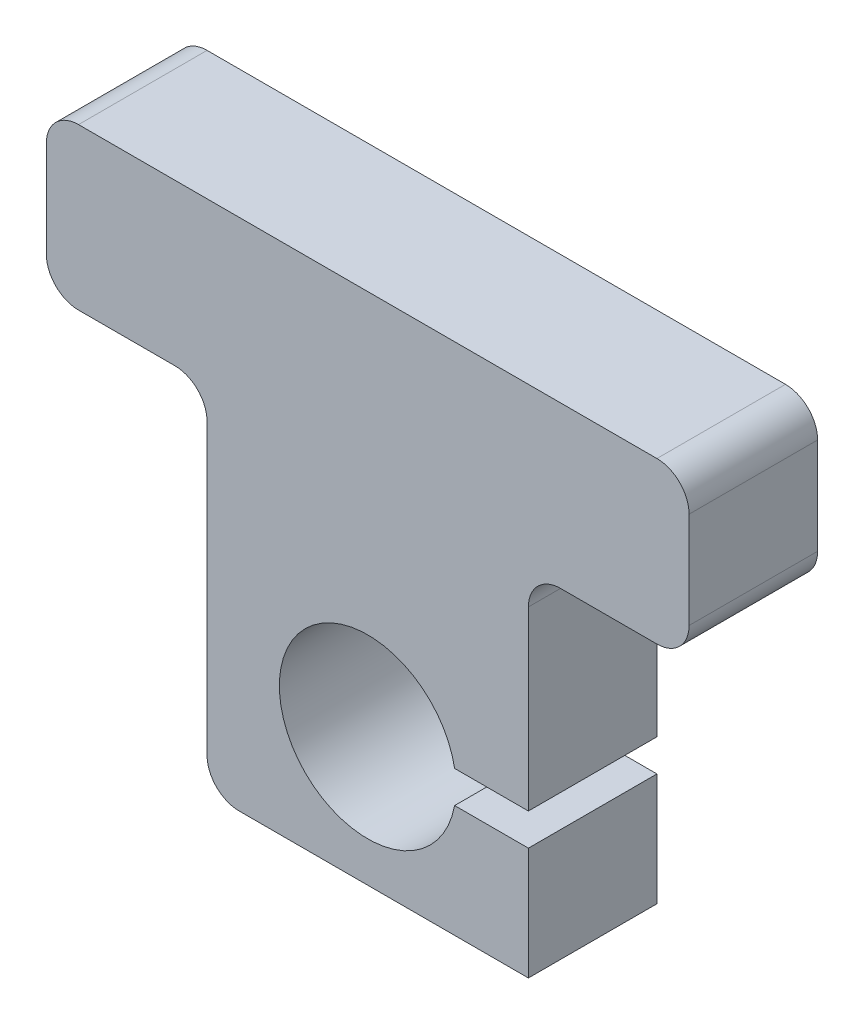
ISO-10303-21;
HEADER;
FILE_DESCRIPTION(('STEP AP214'),'2;1');
FILE_NAME('part.step','',(''),(''),'','','');
FILE_SCHEMA(('AUTOMOTIVE_DESIGN { 1 0 10303 214 1 1 1 1 }'));
ENDSEC;
DATA;
#1=APPLICATION_CONTEXT('core data for automotive mechanical design processes');
#2=APPLICATION_PROTOCOL_DEFINITION('international standard','automotive_design',2000,#1);
#3=PRODUCT_CONTEXT('',#1,'mechanical');
#4=PRODUCT('Part','Part','',(#3));
#5=PRODUCT_RELATED_PRODUCT_CATEGORY('part','',(#4));
#6=PRODUCT_DEFINITION_FORMATION('','',#4);
#7=PRODUCT_DEFINITION_CONTEXT('part definition',#1,'design');
#8=PRODUCT_DEFINITION('design','',#6,#7);
#9=PRODUCT_DEFINITION_SHAPE('','',#8);
#10=(LENGTH_UNIT() NAMED_UNIT(*) SI_UNIT(.MILLI.,.METRE.));
#11=(NAMED_UNIT(*) PLANE_ANGLE_UNIT() SI_UNIT($,.RADIAN.));
#12=(NAMED_UNIT(*) SI_UNIT($,.STERADIAN.) SOLID_ANGLE_UNIT());
#13=UNCERTAINTY_MEASURE_WITH_UNIT(LENGTH_MEASURE(1.E-05),#10,'distance_accuracy_value','');
#14=(GEOMETRIC_REPRESENTATION_CONTEXT(3) GLOBAL_UNCERTAINTY_ASSIGNED_CONTEXT((#13)) GLOBAL_UNIT_ASSIGNED_CONTEXT((#10,
#11,#12)) REPRESENTATION_CONTEXT('',''));
#15=CARTESIAN_POINT('',(0.,0.,0.));
#16=DIRECTION('',(0.,0.,1.));
#17=DIRECTION('',(1.,0.,0.));
#18=AXIS2_PLACEMENT_3D('',#15,#16,#17);
#19=CARTESIAN_POINT('',(12.,12.,8.));
#20=DIRECTION('',(0.,0.,-1.));
#21=DIRECTION('',(-1.,0.,0.));
#22=AXIS2_PLACEMENT_3D('',#19,#20,#21);
#23=CYLINDRICAL_SURFACE('',#22,2.);
#24=CARTESIAN_POINT('',(12.,12.,0.));
#25=DIRECTION('',(0.,0.,-1.));
#26=DIRECTION('',(1.,0.,0.));
#27=AXIS2_PLACEMENT_3D('',#24,#25,#26);
#28=CIRCLE('',#27,2.);
#29=CARTESIAN_POINT('',(10.,12.,0.));
#30=VERTEX_POINT('',#29);
#31=CARTESIAN_POINT('',(12.,14.,0.));
#32=VERTEX_POINT('',#31);
#33=EDGE_CURVE('E195',#30,#32,#28,.T.);
#34=ORIENTED_EDGE('',*,*,#33,.T.);
#35=DIRECTION('',(0.,0.,-1.));
#36=VECTOR('',#35,1.);
#37=CARTESIAN_POINT('',(12.,14.,8.));
#38=LINE('',#37,#36);
#39=CARTESIAN_POINT('',(12.,14.,8.));
#40=VERTEX_POINT('',#39);
#41=EDGE_CURVE('E11',#40,#32,#38,.T.);
#42=ORIENTED_EDGE('',*,*,#41,.F.);
#43=CARTESIAN_POINT('',(12.,12.,8.));
#44=DIRECTION('',(0.,0.,-1.));
#45=DIRECTION('',(1.,0.,0.));
#46=AXIS2_PLACEMENT_3D('',#43,#44,#45);
#47=CIRCLE('',#46,2.);
#48=CARTESIAN_POINT('',(10.,12.,8.));
#49=VERTEX_POINT('',#48);
#50=EDGE_CURVE('E231',#49,#40,#47,.T.);
#51=ORIENTED_EDGE('',*,*,#50,.F.);
#52=DIRECTION('',(0.,0.,-1.));
#53=VECTOR('',#52,1.);
#54=CARTESIAN_POINT('',(10.,12.,8.));
#55=LINE('',#54,#53);
#56=EDGE_CURVE('E191',#49,#30,#55,.T.);
#57=ORIENTED_EDGE('',*,*,#56,.T.);
#58=EDGE_LOOP('',(#34,#42,#51,#57));
#59=FACE_BOUND('',#58,.T.);
#60=ADVANCED_FACE('F33',(#59),#23,.F.);
#61=CARTESIAN_POINT('',(12.,14.,8.));
#62=DIRECTION('',(0.,1.,0.));
#63=DIRECTION('',(0.,0.,1.));
#64=AXIS2_PLACEMENT_3D('',#61,#62,#63);
#65=PLANE('',#64);
#66=DIRECTION('',(1.,0.,0.));
#67=VECTOR('',#66,1.);
#68=CARTESIAN_POINT('',(12.,14.,0.));
#69=LINE('',#68,#67);
#70=CARTESIAN_POINT('',(18.,14.,0.));
#71=VERTEX_POINT('',#70);
#72=EDGE_CURVE('E198',#32,#71,#69,.T.);
#73=ORIENTED_EDGE('',*,*,#72,.T.);
#74=DIRECTION('',(0.,0.,-1.));
#75=VECTOR('',#74,1.);
#76=CARTESIAN_POINT('',(18.,14.,8.));
#77=LINE('',#76,#75);
#78=CARTESIAN_POINT('',(18.,14.,8.));
#79=VERTEX_POINT('',#78);
#80=EDGE_CURVE('E41',#79,#71,#77,.T.);
#81=ORIENTED_EDGE('',*,*,#80,.F.);
#82=DIRECTION('',(1.,0.,0.));
#83=VECTOR('',#82,1.);
#84=CARTESIAN_POINT('',(12.,14.,8.));
#85=LINE('',#84,#83);
#86=EDGE_CURVE('E125',#40,#79,#85,.T.);
#87=ORIENTED_EDGE('',*,*,#86,.F.);
#88=ORIENTED_EDGE('',*,*,#41,.T.);
#89=EDGE_LOOP('',(#73,#81,#87,#88));
#90=FACE_BOUND('',#89,.T.);
#91=ADVANCED_FACE('F344',(#90),#65,.F.);
#92=CARTESIAN_POINT('',(18.,16.,8.));
#93=DIRECTION('',(0.,0.,-1.));
#94=DIRECTION('',(-1.,0.,0.));
#95=AXIS2_PLACEMENT_3D('',#92,#93,#94);
#96=CYLINDRICAL_SURFACE('',#95,2.);
#97=CARTESIAN_POINT('',(18.,16.,0.));
#98=DIRECTION('',(0.,0.,1.));
#99=DIRECTION('',(1.,0.,0.));
#100=AXIS2_PLACEMENT_3D('',#97,#98,#99);
#101=CIRCLE('',#100,2.);
#102=CARTESIAN_POINT('',(20.,16.,0.));
#103=VERTEX_POINT('',#102);
#104=EDGE_CURVE('E200',#71,#103,#101,.T.);
#105=ORIENTED_EDGE('',*,*,#104,.T.);
#106=DIRECTION('',(0.,0.,-1.));
#107=VECTOR('',#106,1.);
#108=CARTESIAN_POINT('',(20.,16.,8.));
#109=LINE('',#108,#107);
#110=CARTESIAN_POINT('',(20.,16.,8.));
#111=VERTEX_POINT('',#110);
#112=EDGE_CURVE('E271',#111,#103,#109,.T.);
#113=ORIENTED_EDGE('',*,*,#112,.F.);
#114=CARTESIAN_POINT('',(18.,16.,8.));
#115=DIRECTION('',(0.,0.,1.));
#116=DIRECTION('',(1.,0.,0.));
#117=AXIS2_PLACEMENT_3D('',#114,#115,#116);
#118=CIRCLE('',#117,2.);
#119=EDGE_CURVE('E279',#79,#111,#118,.T.);
#120=ORIENTED_EDGE('',*,*,#119,.F.);
#121=ORIENTED_EDGE('',*,*,#80,.T.);
#122=EDGE_LOOP('',(#105,#113,#120,#121));
#123=FACE_BOUND('',#122,.T.);
#124=ADVANCED_FACE('F277',(#123),#96,.T.);
#125=CARTESIAN_POINT('',(20.,22.,8.));
#126=DIRECTION('',(-1.,0.,0.));
#127=DIRECTION('',(0.,-1.,0.));
#128=AXIS2_PLACEMENT_3D('',#125,#126,#127);
#129=PLANE('',#128);
#130=DIRECTION('',(0.,1.,0.));
#131=VECTOR('',#130,1.);
#132=CARTESIAN_POINT('',(20.,22.,0.));
#133=LINE('',#132,#131);
#134=CARTESIAN_POINT('',(20.,22.,0.));
#135=VERTEX_POINT('',#134);
#136=EDGE_CURVE('E202',#103,#135,#133,.T.);
#137=ORIENTED_EDGE('',*,*,#136,.T.);
#138=DIRECTION('',(0.,0.,-1.));
#139=VECTOR('',#138,1.);
#140=CARTESIAN_POINT('',(20.,22.,8.));
#141=LINE('',#140,#139);
#142=CARTESIAN_POINT('',(20.,22.,8.));
#143=VERTEX_POINT('',#142);
#144=EDGE_CURVE('E268',#143,#135,#141,.T.);
#145=ORIENTED_EDGE('',*,*,#144,.F.);
#146=DIRECTION('',(0.,1.,0.));
#147=VECTOR('',#146,1.);
#148=CARTESIAN_POINT('',(20.,22.,8.));
#149=LINE('',#148,#147);
#150=EDGE_CURVE('E297',#111,#143,#149,.T.);
#151=ORIENTED_EDGE('',*,*,#150,.F.);
#152=ORIENTED_EDGE('',*,*,#112,.T.);
#153=EDGE_LOOP('',(#137,#145,#151,#152));
#154=FACE_BOUND('',#153,.T.);
#155=ADVANCED_FACE('F288',(#154),#129,.F.);
#156=CARTESIAN_POINT('',(18.,22.,8.));
#157=DIRECTION('',(0.,0.,-1.));
#158=DIRECTION('',(-1.,0.,0.));
#159=AXIS2_PLACEMENT_3D('',#156,#157,#158);
#160=CYLINDRICAL_SURFACE('',#159,2.);
#161=CARTESIAN_POINT('',(18.,22.,0.));
#162=DIRECTION('',(0.,0.,1.));
#163=DIRECTION('',(-1.,0.,0.));
#164=AXIS2_PLACEMENT_3D('',#161,#162,#163);
#165=CIRCLE('',#164,2.);
#166=CARTESIAN_POINT('',(18.,24.,0.));
#167=VERTEX_POINT('',#166);
#168=EDGE_CURVE('E204',#135,#167,#165,.T.);
#169=ORIENTED_EDGE('',*,*,#168,.T.);
#170=DIRECTION('',(0.,0.,-1.));
#171=VECTOR('',#170,1.);
#172=CARTESIAN_POINT('',(18.,24.,8.));
#173=LINE('',#172,#171);
#174=CARTESIAN_POINT('',(18.,24.,8.));
#175=VERTEX_POINT('',#174);
#176=EDGE_CURVE('E265',#175,#167,#173,.T.);
#177=ORIENTED_EDGE('',*,*,#176,.F.);
#178=CARTESIAN_POINT('',(18.,22.,8.));
#179=DIRECTION('',(0.,0.,1.));
#180=DIRECTION('',(-1.,0.,0.));
#181=AXIS2_PLACEMENT_3D('',#178,#179,#180);
#182=CIRCLE('',#181,2.);
#183=EDGE_CURVE('E294',#143,#175,#182,.T.);
#184=ORIENTED_EDGE('',*,*,#183,.F.);
#185=ORIENTED_EDGE('',*,*,#144,.T.);
#186=EDGE_LOOP('',(#169,#177,#184,#185));
#187=FACE_BOUND('',#186,.T.);
#188=ADVANCED_FACE('F292',(#187),#160,.T.);
#189=CARTESIAN_POINT('',(-18.,24.,8.));
#190=DIRECTION('',(0.,-1.,0.));
#191=DIRECTION('',(0.,0.,-1.));
#192=AXIS2_PLACEMENT_3D('',#189,#190,#191);
#193=PLANE('',#192);
#194=DIRECTION('',(-1.,0.,0.));
#195=VECTOR('',#194,1.);
#196=CARTESIAN_POINT('',(-18.,24.,0.));
#197=LINE('',#196,#195);
#198=CARTESIAN_POINT('',(-18.,24.,0.));
#199=VERTEX_POINT('',#198);
#200=EDGE_CURVE('E206',#167,#199,#197,.T.);
#201=ORIENTED_EDGE('',*,*,#200,.T.);
#202=DIRECTION('',(0.,0.,-1.));
#203=VECTOR('',#202,1.);
#204=CARTESIAN_POINT('',(-18.,24.,8.));
#205=LINE('',#204,#203);
#206=CARTESIAN_POINT('',(-18.,24.,8.));
#207=VERTEX_POINT('',#206);
#208=EDGE_CURVE('E262',#207,#199,#205,.T.);
#209=ORIENTED_EDGE('',*,*,#208,.F.);
#210=DIRECTION('',(-1.,0.,0.));
#211=VECTOR('',#210,1.);
#212=CARTESIAN_POINT('',(-18.,24.,8.));
#213=LINE('',#212,#211);
#214=EDGE_CURVE('E296',#175,#207,#213,.T.);
#215=ORIENTED_EDGE('',*,*,#214,.F.);
#216=ORIENTED_EDGE('',*,*,#176,.T.);
#217=EDGE_LOOP('',(#201,#209,#215,#216));
#218=FACE_BOUND('',#217,.T.);
#219=ADVANCED_FACE('F357',(#218),#193,.F.);
#220=CARTESIAN_POINT('',(-18.,22.,8.));
#221=DIRECTION('',(0.,0.,-1.));
#222=DIRECTION('',(-1.,0.,0.));
#223=AXIS2_PLACEMENT_3D('',#220,#221,#222);
#224=CYLINDRICAL_SURFACE('',#223,2.);
#225=CARTESIAN_POINT('',(-18.,22.,0.));
#226=DIRECTION('',(0.,0.,1.));
#227=DIRECTION('',(1.,0.,0.));
#228=AXIS2_PLACEMENT_3D('',#225,#226,#227);
#229=CIRCLE('',#228,2.);
#230=CARTESIAN_POINT('',(-20.,22.,0.));
#231=VERTEX_POINT('',#230);
#232=EDGE_CURVE('E208',#199,#231,#229,.T.);
#233=ORIENTED_EDGE('',*,*,#232,.T.);
#234=DIRECTION('',(0.,0.,-1.));
#235=VECTOR('',#234,1.);
#236=CARTESIAN_POINT('',(-20.,22.,8.));
#237=LINE('',#236,#235);
#238=CARTESIAN_POINT('',(-20.,22.,8.));
#239=VERTEX_POINT('',#238);
#240=EDGE_CURVE('E259',#239,#231,#237,.T.);
#241=ORIENTED_EDGE('',*,*,#240,.F.);
#242=CARTESIAN_POINT('',(-18.,22.,8.));
#243=DIRECTION('',(0.,0.,1.));
#244=DIRECTION('',(1.,0.,0.));
#245=AXIS2_PLACEMENT_3D('',#242,#243,#244);
#246=CIRCLE('',#245,2.);
#247=EDGE_CURVE('E299',#207,#239,#246,.T.);
#248=ORIENTED_EDGE('',*,*,#247,.F.);
#249=ORIENTED_EDGE('',*,*,#208,.T.);
#250=EDGE_LOOP('',(#233,#241,#248,#249));
#251=FACE_BOUND('',#250,.T.);
#252=ADVANCED_FACE('F360',(#251),#224,.T.);
#253=CARTESIAN_POINT('',(-20.,22.,8.));
#254=DIRECTION('',(1.,0.,0.));
#255=DIRECTION('',(0.,0.,-1.));
#256=AXIS2_PLACEMENT_3D('',#253,#254,#255);
#257=PLANE('',#256);
#258=DIRECTION('',(0.,-1.,0.));
#259=VECTOR('',#258,1.);
#260=CARTESIAN_POINT('',(-20.,22.,0.));
#261=LINE('',#260,#259);
#262=CARTESIAN_POINT('',(-20.,16.,0.));
#263=VERTEX_POINT('',#262);
#264=EDGE_CURVE('E210',#231,#263,#261,.T.);
#265=ORIENTED_EDGE('',*,*,#264,.T.);
#266=DIRECTION('',(0.,0.,-1.));
#267=VECTOR('',#266,1.);
#268=CARTESIAN_POINT('',(-20.,16.,8.));
#269=LINE('',#268,#267);
#270=CARTESIAN_POINT('',(-20.,16.,8.));
#271=VERTEX_POINT('',#270);
#272=EDGE_CURVE('E256',#271,#263,#269,.T.);
#273=ORIENTED_EDGE('',*,*,#272,.F.);
#274=DIRECTION('',(0.,-1.,0.));
#275=VECTOR('',#274,1.);
#276=CARTESIAN_POINT('',(-20.,22.,8.));
#277=LINE('',#276,#275);
#278=EDGE_CURVE('E305',#239,#271,#277,.T.);
#279=ORIENTED_EDGE('',*,*,#278,.F.);
#280=ORIENTED_EDGE('',*,*,#240,.T.);
#281=EDGE_LOOP('',(#265,#273,#279,#280));
#282=FACE_BOUND('',#281,.T.);
#283=ADVANCED_FACE('F364',(#282),#257,.F.);
#284=CARTESIAN_POINT('',(-18.,16.,8.));
#285=DIRECTION('',(0.,0.,-1.));
#286=DIRECTION('',(-1.,0.,0.));
#287=AXIS2_PLACEMENT_3D('',#284,#285,#286);
#288=CYLINDRICAL_SURFACE('',#287,2.);
#289=CARTESIAN_POINT('',(-18.,16.,0.));
#290=DIRECTION('',(0.,0.,1.));
#291=DIRECTION('',(1.,0.,0.));
#292=AXIS2_PLACEMENT_3D('',#289,#290,#291);
#293=CIRCLE('',#292,2.);
#294=CARTESIAN_POINT('',(-18.,14.,0.));
#295=VERTEX_POINT('',#294);
#296=EDGE_CURVE('E212',#263,#295,#293,.T.);
#297=ORIENTED_EDGE('',*,*,#296,.T.);
#298=DIRECTION('',(0.,0.,-1.));
#299=VECTOR('',#298,1.);
#300=CARTESIAN_POINT('',(-18.,14.,8.));
#301=LINE('',#300,#299);
#302=CARTESIAN_POINT('',(-18.,14.,8.));
#303=VERTEX_POINT('',#302);
#304=EDGE_CURVE('E253',#303,#295,#301,.T.);
#305=ORIENTED_EDGE('',*,*,#304,.F.);
#306=CARTESIAN_POINT('',(-18.,16.,8.));
#307=DIRECTION('',(0.,0.,1.));
#308=DIRECTION('',(1.,0.,0.));
#309=AXIS2_PLACEMENT_3D('',#306,#307,#308);
#310=CIRCLE('',#309,2.);
#311=EDGE_CURVE('E307',#271,#303,#310,.T.);
#312=ORIENTED_EDGE('',*,*,#311,.F.);
#313=ORIENTED_EDGE('',*,*,#272,.T.);
#314=EDGE_LOOP('',(#297,#305,#312,#313));
#315=FACE_BOUND('',#314,.T.);
#316=ADVANCED_FACE('F368',(#315),#288,.T.);
#317=CARTESIAN_POINT('',(-18.,14.,8.));
#318=DIRECTION('',(0.,1.,0.));
#319=DIRECTION('',(0.,0.,1.));
#320=AXIS2_PLACEMENT_3D('',#317,#318,#319);
#321=PLANE('',#320);
#322=DIRECTION('',(1.,0.,0.));
#323=VECTOR('',#322,1.);
#324=CARTESIAN_POINT('',(-18.,14.,0.));
#325=LINE('',#324,#323);
#326=CARTESIAN_POINT('',(-12.,14.,0.));
#327=VERTEX_POINT('',#326);
#328=EDGE_CURVE('E214',#295,#327,#325,.T.);
#329=ORIENTED_EDGE('',*,*,#328,.T.);
#330=DIRECTION('',(0.,0.,-1.));
#331=VECTOR('',#330,1.);
#332=CARTESIAN_POINT('',(-12.,14.,8.));
#333=LINE('',#332,#331);
#334=CARTESIAN_POINT('',(-12.,14.,8.));
#335=VERTEX_POINT('',#334);
#336=EDGE_CURVE('E250',#335,#327,#333,.T.);
#337=ORIENTED_EDGE('',*,*,#336,.F.);
#338=DIRECTION('',(1.,0.,0.));
#339=VECTOR('',#338,1.);
#340=CARTESIAN_POINT('',(-18.,14.,8.));
#341=LINE('',#340,#339);
#342=EDGE_CURVE('E309',#303,#335,#341,.T.);
#343=ORIENTED_EDGE('',*,*,#342,.F.);
#344=ORIENTED_EDGE('',*,*,#304,.T.);
#345=EDGE_LOOP('',(#329,#337,#343,#344));
#346=FACE_BOUND('',#345,.T.);
#347=ADVANCED_FACE('F372',(#346),#321,.F.);
#348=CARTESIAN_POINT('',(-12.,12.,8.));
#349=DIRECTION('',(0.,0.,-1.));
#350=DIRECTION('',(-1.,0.,0.));
#351=AXIS2_PLACEMENT_3D('',#348,#349,#350);
#352=CYLINDRICAL_SURFACE('',#351,2.);
#353=CARTESIAN_POINT('',(-12.,12.,0.));
#354=DIRECTION('',(0.,0.,-1.));
#355=DIRECTION('',(1.,0.,0.));
#356=AXIS2_PLACEMENT_3D('',#353,#354,#355);
#357=CIRCLE('',#356,2.);
#358=CARTESIAN_POINT('',(-10.,12.,0.));
#359=VERTEX_POINT('',#358);
#360=EDGE_CURVE('E216',#327,#359,#357,.T.);
#361=ORIENTED_EDGE('',*,*,#360,.T.);
#362=DIRECTION('',(0.,0.,-1.));
#363=VECTOR('',#362,1.);
#364=CARTESIAN_POINT('',(-10.,12.,8.));
#365=LINE('',#364,#363);
#366=CARTESIAN_POINT('',(-10.,12.,8.));
#367=VERTEX_POINT('',#366);
#368=EDGE_CURVE('E247',#367,#359,#365,.T.);
#369=ORIENTED_EDGE('',*,*,#368,.F.);
#370=CARTESIAN_POINT('',(-12.,12.,8.));
#371=DIRECTION('',(0.,0.,-1.));
#372=DIRECTION('',(1.,0.,0.));
#373=AXIS2_PLACEMENT_3D('',#370,#371,#372);
#374=CIRCLE('',#373,2.);
#375=EDGE_CURVE('E311',#335,#367,#374,.T.);
#376=ORIENTED_EDGE('',*,*,#375,.F.);
#377=ORIENTED_EDGE('',*,*,#336,.T.);
#378=EDGE_LOOP('',(#361,#369,#376,#377));
#379=FACE_BOUND('',#378,.T.);
#380=ADVANCED_FACE('F376',(#379),#352,.F.);
#381=CARTESIAN_POINT('',(-10.,-6.,8.));
#382=DIRECTION('',(1.,0.,0.));
#383=DIRECTION('',(0.,0.,-1.));
#384=AXIS2_PLACEMENT_3D('',#381,#382,#383);
#385=PLANE('',#384);
#386=DIRECTION('',(0.,-1.,0.));
#387=VECTOR('',#386,1.);
#388=CARTESIAN_POINT('',(-10.,-6.,0.));
#389=LINE('',#388,#387);
#390=CARTESIAN_POINT('',(-10.,-6.,0.));
#391=VERTEX_POINT('',#390);
#392=EDGE_CURVE('E218',#359,#391,#389,.T.);
#393=ORIENTED_EDGE('',*,*,#392,.T.);
#394=DIRECTION('',(0.,0.,-1.));
#395=VECTOR('',#394,1.);
#396=CARTESIAN_POINT('',(-10.,-6.,8.));
#397=LINE('',#396,#395);
#398=CARTESIAN_POINT('',(-10.,-6.,8.));
#399=VERTEX_POINT('',#398);
#400=EDGE_CURVE('E244',#399,#391,#397,.T.);
#401=ORIENTED_EDGE('',*,*,#400,.F.);
#402=DIRECTION('',(0.,-1.,0.));
#403=VECTOR('',#402,1.);
#404=CARTESIAN_POINT('',(-10.,-6.,8.));
#405=LINE('',#404,#403);
#406=EDGE_CURVE('E313',#367,#399,#405,.T.);
#407=ORIENTED_EDGE('',*,*,#406,.F.);
#408=ORIENTED_EDGE('',*,*,#368,.T.);
#409=EDGE_LOOP('',(#393,#401,#407,#408));
#410=FACE_BOUND('',#409,.T.);
#411=ADVANCED_FACE('F380',(#410),#385,.F.);
#412=CARTESIAN_POINT('',(-8.,-6.,8.));
#413=DIRECTION('',(0.,0.,-1.));
#414=DIRECTION('',(-1.,0.,0.));
#415=AXIS2_PLACEMENT_3D('',#412,#413,#414);
#416=CYLINDRICAL_SURFACE('',#415,2.);
#417=CARTESIAN_POINT('',(-8.,-6.,0.));
#418=DIRECTION('',(0.,0.,1.));
#419=DIRECTION('',(-1.,0.,0.));
#420=AXIS2_PLACEMENT_3D('',#417,#418,#419);
#421=CIRCLE('',#420,2.);
#422=CARTESIAN_POINT('',(-8.,-8.,0.));
#423=VERTEX_POINT('',#422);
#424=EDGE_CURVE('E220',#391,#423,#421,.T.);
#425=ORIENTED_EDGE('',*,*,#424,.T.);
#426=DIRECTION('',(0.,0.,-1.));
#427=VECTOR('',#426,1.);
#428=CARTESIAN_POINT('',(-8.,-8.,8.));
#429=LINE('',#428,#427);
#430=CARTESIAN_POINT('',(-8.,-8.,8.));
#431=VERTEX_POINT('',#430);
#432=EDGE_CURVE('E241',#431,#423,#429,.T.);
#433=ORIENTED_EDGE('',*,*,#432,.F.);
#434=CARTESIAN_POINT('',(-8.,-6.,8.));
#435=DIRECTION('',(0.,0.,1.));
#436=DIRECTION('',(-1.,0.,0.));
#437=AXIS2_PLACEMENT_3D('',#434,#435,#436);
#438=CIRCLE('',#437,2.);
#439=EDGE_CURVE('E315',#399,#431,#438,.T.);
#440=ORIENTED_EDGE('',*,*,#439,.F.);
#441=ORIENTED_EDGE('',*,*,#400,.T.);
#442=EDGE_LOOP('',(#425,#433,#440,#441));
#443=FACE_BOUND('',#442,.T.);
#444=ADVANCED_FACE('F384',(#443),#416,.T.);
#445=CARTESIAN_POINT('',(-8.,-8.,8.));
#446=DIRECTION('',(0.,1.,0.));
#447=DIRECTION('',(0.,0.,1.));
#448=AXIS2_PLACEMENT_3D('',#445,#446,#447);
#449=PLANE('',#448);
#450=DIRECTION('',(1.,0.,0.));
#451=VECTOR('',#450,1.);
#452=CARTESIAN_POINT('',(-8.,-8.,0.));
#453=LINE('',#452,#451);
#454=CARTESIAN_POINT('',(10.,-8.,0.));
#455=VERTEX_POINT('',#454);
#456=EDGE_CURVE('E222',#423,#455,#453,.T.);
#457=ORIENTED_EDGE('',*,*,#456,.T.);
#458=DIRECTION('',(0.,0.,-1.));
#459=VECTOR('',#458,1.);
#460=CARTESIAN_POINT('',(10.,-8.,8.));
#461=LINE('',#460,#459);
#462=CARTESIAN_POINT('',(10.,-8.,8.));
#463=VERTEX_POINT('',#462);
#464=EDGE_CURVE('E238',#463,#455,#461,.T.);
#465=ORIENTED_EDGE('',*,*,#464,.F.);
#466=DIRECTION('',(1.,0.,0.));
#467=VECTOR('',#466,1.);
#468=CARTESIAN_POINT('',(-8.,-8.,8.));
#469=LINE('',#468,#467);
#470=EDGE_CURVE('E317',#431,#463,#469,.T.);
#471=ORIENTED_EDGE('',*,*,#470,.F.);
#472=ORIENTED_EDGE('',*,*,#432,.T.);
#473=EDGE_LOOP('',(#457,#465,#471,#472));
#474=FACE_BOUND('',#473,.T.);
#475=ADVANCED_FACE('F388',(#474),#449,.F.);
#476=CARTESIAN_POINT('',(10.,-8.,8.));
#477=DIRECTION('',(-1.,0.,0.));
#478=DIRECTION('',(0.,0.,1.));
#479=AXIS2_PLACEMENT_3D('',#476,#477,#478);
#480=PLANE('',#479);
#481=DIRECTION('',(0.,1.,0.));
#482=VECTOR('',#481,1.);
#483=CARTESIAN_POINT('',(10.,-8.,0.));
#484=LINE('',#483,#482);
#485=CARTESIAN_POINT('',(10.,-1.,0.));
#486=VERTEX_POINT('',#485);
#487=EDGE_CURVE('E224',#455,#486,#484,.T.);
#488=ORIENTED_EDGE('',*,*,#487,.T.);
#489=DIRECTION('',(0.,0.,-1.));
#490=VECTOR('',#489,1.);
#491=CARTESIAN_POINT('',(10.,-1.,8.));
#492=LINE('',#491,#490);
#493=CARTESIAN_POINT('',(10.,-1.,8.));
#494=VERTEX_POINT('',#493);
#495=EDGE_CURVE('E235',#494,#486,#492,.T.);
#496=ORIENTED_EDGE('',*,*,#495,.F.);
#497=DIRECTION('',(0.,1.,0.));
#498=VECTOR('',#497,1.);
#499=CARTESIAN_POINT('',(10.,-8.,8.));
#500=LINE('',#499,#498);
#501=EDGE_CURVE('E319',#463,#494,#500,.T.);
#502=ORIENTED_EDGE('',*,*,#501,.F.);
#503=ORIENTED_EDGE('',*,*,#464,.T.);
#504=EDGE_LOOP('',(#488,#496,#502,#503));
#505=FACE_BOUND('',#504,.T.);
#506=ADVANCED_FACE('F325',(#505),#480,.F.);
#507=CARTESIAN_POINT('',(5.40832691319598,-1.,8.));
#508=DIRECTION('',(0.,-1.,0.));
#509=DIRECTION('',(1.,0.,0.));
#510=AXIS2_PLACEMENT_3D('',#507,#508,#509);
#511=PLANE('',#510);
#512=DIRECTION('',(-1.,0.,0.));
#513=VECTOR('',#512,1.);
#514=CARTESIAN_POINT('',(5.40832691319598,-1.,0.));
#515=LINE('',#514,#513);
#516=CARTESIAN_POINT('',(5.40832691319598,-1.,0.));
#517=VERTEX_POINT('',#516);
#518=EDGE_CURVE('E226',#486,#517,#515,.T.);
#519=ORIENTED_EDGE('',*,*,#518,.T.);
#520=DIRECTION('',(0.,0.,-1.));
#521=VECTOR('',#520,1.);
#522=CARTESIAN_POINT('',(5.40832691319598,-1.,8.));
#523=LINE('',#522,#521);
#524=CARTESIAN_POINT('',(5.40832691319598,-1.,8.));
#525=VERTEX_POINT('',#524);
#526=EDGE_CURVE('E186',#525,#517,#523,.T.);
#527=ORIENTED_EDGE('',*,*,#526,.F.);
#528=DIRECTION('',(-1.,0.,0.));
#529=VECTOR('',#528,1.);
#530=CARTESIAN_POINT('',(5.40832691319598,-1.,8.));
#531=LINE('',#530,#529);
#532=EDGE_CURVE('E177',#494,#525,#531,.T.);
#533=ORIENTED_EDGE('',*,*,#532,.F.);
#534=ORIENTED_EDGE('',*,*,#495,.T.);
#535=EDGE_LOOP('',(#519,#527,#533,#534));
#536=FACE_BOUND('',#535,.T.);
#537=ADVANCED_FACE('F329',(#536),#511,.F.);
#538=CARTESIAN_POINT('',(0.,0.,8.));
#539=DIRECTION('',(0.,0.,-1.));
#540=DIRECTION('',(-1.,0.,0.));
#541=AXIS2_PLACEMENT_3D('',#538,#539,#540);
#542=CYLINDRICAL_SURFACE('',#541,5.5);
#543=CARTESIAN_POINT('',(0.,0.,0.));
#544=DIRECTION('',(0.,0.,-1.));
#545=DIRECTION('',(1.,0.,0.));
#546=AXIS2_PLACEMENT_3D('',#543,#544,#545);
#547=CIRCLE('',#546,5.5);
#548=CARTESIAN_POINT('',(5.40832691319598,1.,0.));
#549=VERTEX_POINT('',#548);
#550=EDGE_CURVE('E185',#517,#549,#547,.T.);
#551=ORIENTED_EDGE('',*,*,#550,.T.);
#552=DIRECTION('',(0.,0.,-1.));
#553=VECTOR('',#552,1.);
#554=CARTESIAN_POINT('',(5.40832691319598,1.,8.));
#555=LINE('',#554,#553);
#556=CARTESIAN_POINT('',(5.40832691319598,1.,8.));
#557=VERTEX_POINT('',#556);
#558=EDGE_CURVE('E182',#557,#549,#555,.T.);
#559=ORIENTED_EDGE('',*,*,#558,.F.);
#560=CARTESIAN_POINT('',(0.,0.,8.));
#561=DIRECTION('',(0.,0.,-1.));
#562=DIRECTION('',(1.,0.,0.));
#563=AXIS2_PLACEMENT_3D('',#560,#561,#562);
#564=CIRCLE('',#563,5.5);
#565=EDGE_CURVE('E171',#525,#557,#564,.T.);
#566=ORIENTED_EDGE('',*,*,#565,.F.);
#567=ORIENTED_EDGE('',*,*,#526,.T.);
#568=EDGE_LOOP('',(#551,#559,#566,#567));
#569=FACE_BOUND('',#568,.T.);
#570=ADVANCED_FACE('F183',(#569),#542,.F.);
#571=CARTESIAN_POINT('',(5.40832691319598,1.,8.));
#572=DIRECTION('',(0.,1.,0.));
#573=DIRECTION('',(0.,0.,1.));
#574=AXIS2_PLACEMENT_3D('',#571,#572,#573);
#575=PLANE('',#574);
#576=DIRECTION('',(1.,0.,0.));
#577=VECTOR('',#576,1.);
#578=CARTESIAN_POINT('',(5.40832691319598,1.,0.));
#579=LINE('',#578,#577);
#580=CARTESIAN_POINT('',(10.,1.,0.));
#581=VERTEX_POINT('',#580);
#582=EDGE_CURVE('E111',#549,#581,#579,.T.);
#583=ORIENTED_EDGE('',*,*,#582,.T.);
#584=DIRECTION('',(0.,0.,-1.));
#585=VECTOR('',#584,1.);
#586=CARTESIAN_POINT('',(10.,1.,8.));
#587=LINE('',#586,#585);
#588=CARTESIAN_POINT('',(10.,1.,8.));
#589=VERTEX_POINT('',#588);
#590=EDGE_CURVE('E187',#589,#581,#587,.T.);
#591=ORIENTED_EDGE('',*,*,#590,.F.);
#592=DIRECTION('',(1.,0.,0.));
#593=VECTOR('',#592,1.);
#594=CARTESIAN_POINT('',(5.40832691319598,1.,8.));
#595=LINE('',#594,#593);
#596=EDGE_CURVE('E175',#557,#589,#595,.T.);
#597=ORIENTED_EDGE('',*,*,#596,.F.);
#598=ORIENTED_EDGE('',*,*,#558,.T.);
#599=EDGE_LOOP('',(#583,#591,#597,#598));
#600=FACE_BOUND('',#599,.T.);
#601=ADVANCED_FACE('F189',(#600),#575,.F.);
#602=CARTESIAN_POINT('',(10.,1.,8.));
#603=DIRECTION('',(-1.,0.,0.));
#604=DIRECTION('',(0.,0.,1.));
#605=AXIS2_PLACEMENT_3D('',#602,#603,#604);
#606=PLANE('',#605);
#607=DIRECTION('',(0.,1.,0.));
#608=VECTOR('',#607,1.);
#609=CARTESIAN_POINT('',(10.,1.,0.));
#610=LINE('',#609,#608);
#611=EDGE_CURVE('E117',#581,#30,#610,.T.);
#612=ORIENTED_EDGE('',*,*,#611,.T.);
#613=ORIENTED_EDGE('',*,*,#56,.F.);
#614=DIRECTION('',(0.,1.,0.));
#615=VECTOR('',#614,1.);
#616=CARTESIAN_POINT('',(10.,1.,8.));
#617=LINE('',#616,#615);
#618=EDGE_CURVE('E49',#589,#49,#617,.T.);
#619=ORIENTED_EDGE('',*,*,#618,.F.);
#620=ORIENTED_EDGE('',*,*,#590,.T.);
#621=EDGE_LOOP('',(#612,#613,#619,#620));
#622=FACE_BOUND('',#621,.T.);
#623=ADVANCED_FACE('F333',(#622),#606,.F.);
#624=CARTESIAN_POINT('',(12.,12.,8.));
#625=DIRECTION('',(0.,0.,1.));
#626=DIRECTION('',(1.,0.,0.));
#627=AXIS2_PLACEMENT_3D('',#624,#625,#626);
#628=PLANE('',#627);
#629=ORIENTED_EDGE('',*,*,#50,.T.);
#630=ORIENTED_EDGE('',*,*,#86,.T.);
#631=ORIENTED_EDGE('',*,*,#119,.T.);
#632=ORIENTED_EDGE('',*,*,#150,.T.);
#633=ORIENTED_EDGE('',*,*,#183,.T.);
#634=ORIENTED_EDGE('',*,*,#214,.T.);
#635=ORIENTED_EDGE('',*,*,#247,.T.);
#636=ORIENTED_EDGE('',*,*,#278,.T.);
#637=ORIENTED_EDGE('',*,*,#311,.T.);
#638=ORIENTED_EDGE('',*,*,#342,.T.);
#639=ORIENTED_EDGE('',*,*,#375,.T.);
#640=ORIENTED_EDGE('',*,*,#406,.T.);
#641=ORIENTED_EDGE('',*,*,#439,.T.);
#642=ORIENTED_EDGE('',*,*,#470,.T.);
#643=ORIENTED_EDGE('',*,*,#501,.T.);
#644=ORIENTED_EDGE('',*,*,#532,.T.);
#645=ORIENTED_EDGE('',*,*,#565,.T.);
#646=ORIENTED_EDGE('',*,*,#596,.T.);
#647=ORIENTED_EDGE('',*,*,#618,.T.);
#648=EDGE_LOOP('',(#629,#630,#631,#632,#633,#634,#635,#636,#637,#638,#639,#640,#641,#642,#643,
#644,#645,#646,#647));
#649=FACE_BOUND('',#648,.T.);
#650=ADVANCED_FACE('F173',(#649),#628,.T.);
#651=CARTESIAN_POINT('',(12.,12.,0.));
#652=DIRECTION('',(0.,0.,1.));
#653=DIRECTION('',(1.,0.,0.));
#654=AXIS2_PLACEMENT_3D('',#651,#652,#653);
#655=PLANE('',#654);
#656=ORIENTED_EDGE('',*,*,#33,.F.);
#657=ORIENTED_EDGE('',*,*,#611,.F.);
#658=ORIENTED_EDGE('',*,*,#582,.F.);
#659=ORIENTED_EDGE('',*,*,#550,.F.);
#660=ORIENTED_EDGE('',*,*,#518,.F.);
#661=ORIENTED_EDGE('',*,*,#487,.F.);
#662=ORIENTED_EDGE('',*,*,#456,.F.);
#663=ORIENTED_EDGE('',*,*,#424,.F.);
#664=ORIENTED_EDGE('',*,*,#392,.F.);
#665=ORIENTED_EDGE('',*,*,#360,.F.);
#666=ORIENTED_EDGE('',*,*,#328,.F.);
#667=ORIENTED_EDGE('',*,*,#296,.F.);
#668=ORIENTED_EDGE('',*,*,#264,.F.);
#669=ORIENTED_EDGE('',*,*,#232,.F.);
#670=ORIENTED_EDGE('',*,*,#200,.F.);
#671=ORIENTED_EDGE('',*,*,#168,.F.);
#672=ORIENTED_EDGE('',*,*,#136,.F.);
#673=ORIENTED_EDGE('',*,*,#104,.F.);
#674=ORIENTED_EDGE('',*,*,#72,.F.);
#675=EDGE_LOOP('',(#656,#657,#658,#659,#660,#661,#662,#663,#664,#665,#666,#667,#668,#669,#670,
#671,#672,#673,#674));
#676=FACE_BOUND('',#675,.T.);
#677=ADVANCED_FACE('F283',(#676),#655,.F.);
#678=CLOSED_SHELL('',(#60,#91,#124,#155,#188,#219,#252,#283,#316,#347,#380,#411,#444,#475,#506,
#537,#570,#601,#623,#650,#677));
#679=MANIFOLD_SOLID_BREP('B2',#678);
#680=ADVANCED_BREP_SHAPE_REPRESENTATION('',(#18,#679),#14);
#681=SHAPE_DEFINITION_REPRESENTATION(#9,#680);
ENDSEC;
END-ISO-10303-21;
